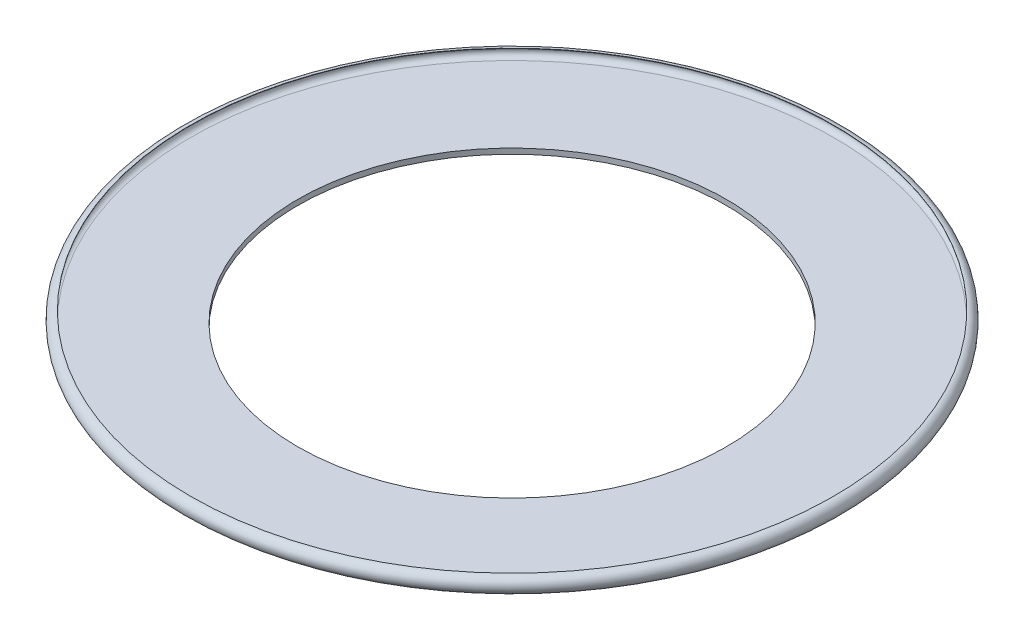
ISO-10303-21;
HEADER;
FILE_DESCRIPTION(('STEP AP214'),'2;1');
FILE_NAME('part.step','',(''),(''),'','','');
FILE_SCHEMA(('AUTOMOTIVE_DESIGN { 1 0 10303 214 1 1 1 1 }'));
ENDSEC;
DATA;
#1=APPLICATION_CONTEXT('core data for automotive mechanical design processes');
#2=APPLICATION_PROTOCOL_DEFINITION('international standard','automotive_design',2000,#1);
#3=PRODUCT_CONTEXT('',#1,'mechanical');
#4=PRODUCT('Part','Part','',(#3));
#5=PRODUCT_RELATED_PRODUCT_CATEGORY('part','',(#4));
#6=PRODUCT_DEFINITION_FORMATION('','',#4);
#7=PRODUCT_DEFINITION_CONTEXT('part definition',#1,'design');
#8=PRODUCT_DEFINITION('design','',#6,#7);
#9=PRODUCT_DEFINITION_SHAPE('','',#8);
#10=(LENGTH_UNIT() NAMED_UNIT(*) SI_UNIT(.MILLI.,.METRE.));
#11=(NAMED_UNIT(*) PLANE_ANGLE_UNIT() SI_UNIT($,.RADIAN.));
#12=(NAMED_UNIT(*) SI_UNIT($,.STERADIAN.) SOLID_ANGLE_UNIT());
#13=UNCERTAINTY_MEASURE_WITH_UNIT(LENGTH_MEASURE(1.E-05),#10,'distance_accuracy_value','');
#14=(GEOMETRIC_REPRESENTATION_CONTEXT(3) GLOBAL_UNCERTAINTY_ASSIGNED_CONTEXT((#13)) GLOBAL_UNIT_ASSIGNED_CONTEXT((#10,
#11,#12)) REPRESENTATION_CONTEXT('',''));
#15=CARTESIAN_POINT('',(0.,0.,0.));
#16=DIRECTION('',(0.,0.,1.));
#17=DIRECTION('',(1.,0.,0.));
#18=AXIS2_PLACEMENT_3D('',#15,#16,#17);
#19=CARTESIAN_POINT('',(0.,2.54,0.));
#20=DIRECTION('',(0.,1.,0.));
#21=DIRECTION('',(0.,0.,1.));
#22=AXIS2_PLACEMENT_3D('',#19,#20,#21);
#23=PLANE('',#22);
#24=CARTESIAN_POINT('',(0.,2.54,0.));
#25=DIRECTION('',(0.,1.,0.));
#26=DIRECTION('',(0.,0.,1.));
#27=AXIS2_PLACEMENT_3D('',#24,#25,#26);
#28=CIRCLE('',#27,152.4);
#29=CARTESIAN_POINT('',(0.,2.54,152.4));
#30=VERTEX_POINT('',#29);
#31=EDGE_CURVE('E66',#30,#30,#28,.T.);
#32=ORIENTED_EDGE('',*,*,#31,.T.);
#33=EDGE_LOOP('',(#32));
#34=FACE_BOUND('',#33,.T.);
#35=CARTESIAN_POINT('',(0.,2.54,0.));
#36=DIRECTION('',(0.,1.,0.));
#37=DIRECTION('',(0.,0.,1.));
#38=AXIS2_PLACEMENT_3D('',#35,#36,#37);
#39=CIRCLE('',#38,101.6);
#40=CARTESIAN_POINT('',(0.,2.54,101.6));
#41=VERTEX_POINT('',#40);
#42=EDGE_CURVE('E50',#41,#41,#39,.T.);
#43=ORIENTED_EDGE('',*,*,#42,.F.);
#44=EDGE_LOOP('',(#43));
#45=FACE_BOUND('',#44,.T.);
#46=ADVANCED_FACE('F43',(#34,#45),#23,.T.);
#47=CARTESIAN_POINT('',(0.,0.,0.));
#48=DIRECTION('',(0.,1.,0.));
#49=DIRECTION('',(0.,0.,1.));
#50=AXIS2_PLACEMENT_3D('',#47,#48,#49);
#51=PLANE('',#50);
#52=CARTESIAN_POINT('',(0.,0.,0.));
#53=DIRECTION('',(0.,1.,0.));
#54=DIRECTION('',(0.,0.,1.));
#55=AXIS2_PLACEMENT_3D('',#52,#53,#54);
#56=CIRCLE('',#55,152.4);
#57=CARTESIAN_POINT('',(0.,0.,152.4));
#58=VERTEX_POINT('',#57);
#59=EDGE_CURVE('E12',#58,#58,#56,.T.);
#60=ORIENTED_EDGE('',*,*,#59,.F.);
#61=EDGE_LOOP('',(#60));
#62=FACE_BOUND('',#61,.T.);
#63=CARTESIAN_POINT('',(0.,0.,0.));
#64=DIRECTION('',(0.,1.,0.));
#65=DIRECTION('',(0.,0.,1.));
#66=AXIS2_PLACEMENT_3D('',#63,#64,#65);
#67=CIRCLE('',#66,101.6);
#68=CARTESIAN_POINT('',(0.,0.,101.6));
#69=VERTEX_POINT('',#68);
#70=EDGE_CURVE('E54',#69,#69,#67,.T.);
#71=ORIENTED_EDGE('',*,*,#70,.T.);
#72=EDGE_LOOP('',(#71));
#73=FACE_BOUND('',#72,.T.);
#74=ADVANCED_FACE('F45',(#62,#73),#51,.F.);
#75=CARTESIAN_POINT('',(0.,2.54,0.));
#76=DIRECTION('',(0.,-1.,0.));
#77=DIRECTION('',(0.,0.,-1.));
#78=AXIS2_PLACEMENT_3D('',#75,#76,#77);
#79=CYLINDRICAL_SURFACE('',#78,101.6);
#80=ORIENTED_EDGE('',*,*,#42,.T.);
#81=EDGE_LOOP('',(#80));
#82=FACE_BOUND('',#81,.T.);
#83=ORIENTED_EDGE('',*,*,#70,.F.);
#84=EDGE_LOOP('',(#83));
#85=FACE_BOUND('',#84,.T.);
#86=ADVANCED_FACE('F87',(#82,#85),#79,.F.);
#87=CARTESIAN_POINT('',(0.,3.81,0.));
#88=DIRECTION('',(0.,1.,0.));
#89=DIRECTION('',(0.,0.,1.));
#90=AXIS2_PLACEMENT_3D('',#87,#88,#89);
#91=TOROIDAL_SURFACE('',#90,152.4,3.81);
#92=ORIENTED_EDGE('',*,*,#59,.T.);
#93=EDGE_LOOP('',(#92));
#94=FACE_BOUND('',#93,.T.);
#95=CARTESIAN_POINT('',(0.,7.62,0.));
#96=DIRECTION('',(0.,1.,0.));
#97=DIRECTION('',(0.,0.,1.));
#98=AXIS2_PLACEMENT_3D('',#95,#96,#97);
#99=CIRCLE('',#98,152.4);
#100=CARTESIAN_POINT('',(0.,7.62,152.4));
#101=VERTEX_POINT('',#100);
#102=EDGE_CURVE('E59',#101,#101,#99,.T.);
#103=ORIENTED_EDGE('',*,*,#102,.F.);
#104=EDGE_LOOP('',(#103));
#105=FACE_BOUND('',#104,.T.);
#106=ADVANCED_FACE('F80',(#94,#105),#91,.T.);
#107=CARTESIAN_POINT('',(0.,70.5483334696169,0.));
#108=DIRECTION('',(0.,1.,0.));
#109=DIRECTION('',(0.,0.,1.));
#110=AXIS2_PLACEMENT_3D('',#107,#108,#109);
#111=CYLINDRICAL_SURFACE('',#110,152.4);
#112=ORIENTED_EDGE('',*,*,#102,.T.);
#113=EDGE_LOOP('',(#112));
#114=FACE_BOUND('',#113,.T.);
#115=CARTESIAN_POINT('',(0.,7.4676,0.));
#116=DIRECTION('',(0.,1.,0.));
#117=DIRECTION('',(0.,0.,1.));
#118=AXIS2_PLACEMENT_3D('',#115,#116,#117);
#119=CIRCLE('',#118,152.4);
#120=CARTESIAN_POINT('',(0.,7.4676,152.4));
#121=VERTEX_POINT('',#120);
#122=EDGE_CURVE('E63',#121,#121,#119,.T.);
#123=ORIENTED_EDGE('',*,*,#122,.F.);
#124=EDGE_LOOP('',(#123));
#125=FACE_BOUND('',#124,.T.);
#126=ADVANCED_FACE('F74',(#114,#125),#111,.F.);
#127=CARTESIAN_POINT('',(0.,5.0038,0.));
#128=DIRECTION('',(0.,1.,0.));
#129=DIRECTION('',(0.,0.,1.));
#130=AXIS2_PLACEMENT_3D('',#127,#128,#129);
#131=TOROIDAL_SURFACE('',#130,152.4,2.4638);
#132=ORIENTED_EDGE('',*,*,#122,.T.);
#133=EDGE_LOOP('',(#132));
#134=FACE_BOUND('',#133,.T.);
#135=ORIENTED_EDGE('',*,*,#31,.F.);
#136=EDGE_LOOP('',(#135));
#137=FACE_BOUND('',#136,.T.);
#138=ADVANCED_FACE('F72',(#134,#137),#131,.F.);
#139=CLOSED_SHELL('',(#46,#74,#86,#106,#126,#138));
#140=MANIFOLD_SOLID_BREP('B2',#139);
#141=ADVANCED_BREP_SHAPE_REPRESENTATION('',(#18,#140),#14);
#142=SHAPE_DEFINITION_REPRESENTATION(#9,#141);
ENDSEC;
END-ISO-10303-21;
